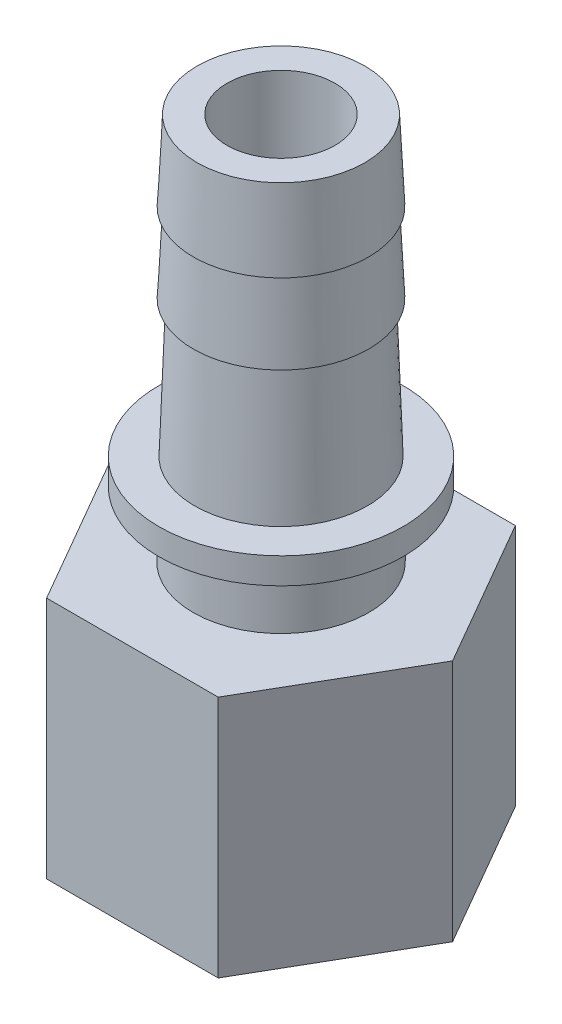
ISO-10303-21;
HEADER;
FILE_DESCRIPTION(('STEP AP214'),'2;1');
FILE_NAME('part.step','',(''),(''),'','','');
FILE_SCHEMA(('AUTOMOTIVE_DESIGN { 1 0 10303 214 1 1 1 1 }'));
ENDSEC;
DATA;
#1=APPLICATION_CONTEXT('core data for automotive mechanical design processes');
#2=APPLICATION_PROTOCOL_DEFINITION('international standard','automotive_design',2000,#1);
#3=PRODUCT_CONTEXT('',#1,'mechanical');
#4=PRODUCT('Part','Part','',(#3));
#5=PRODUCT_RELATED_PRODUCT_CATEGORY('part','',(#4));
#6=PRODUCT_DEFINITION_FORMATION('','',#4);
#7=PRODUCT_DEFINITION_CONTEXT('part definition',#1,'design');
#8=PRODUCT_DEFINITION('design','',#6,#7);
#9=PRODUCT_DEFINITION_SHAPE('','',#8);
#10=(LENGTH_UNIT() NAMED_UNIT(*) SI_UNIT(.MILLI.,.METRE.));
#11=(NAMED_UNIT(*) PLANE_ANGLE_UNIT() SI_UNIT($,.RADIAN.));
#12=(NAMED_UNIT(*) SI_UNIT($,.STERADIAN.) SOLID_ANGLE_UNIT());
#13=UNCERTAINTY_MEASURE_WITH_UNIT(LENGTH_MEASURE(1.E-05),#10,'distance_accuracy_value','');
#14=(GEOMETRIC_REPRESENTATION_CONTEXT(3) GLOBAL_UNCERTAINTY_ASSIGNED_CONTEXT((#13)) GLOBAL_UNIT_ASSIGNED_CONTEXT((#10,
#11,#12)) REPRESENTATION_CONTEXT('',''));
#15=CARTESIAN_POINT('',(0.,0.,0.));
#16=DIRECTION('',(0.,0.,1.));
#17=DIRECTION('',(1.,0.,0.));
#18=AXIS2_PLACEMENT_3D('',#15,#16,#17);
#19=CARTESIAN_POINT('',(20.156625803029,28.575,0.));
#20=DIRECTION('',(-0.866025403784439,0.,0.5));
#21=DIRECTION('',(0.5,0.,0.866025403784439));
#22=AXIS2_PLACEMENT_3D('',#19,#20,#21);
#23=PLANE('',#22);
#24=DIRECTION('',(-0.5,0.,-0.866025403784439));
#25=VECTOR('',#24,1.);
#26=CARTESIAN_POINT('',(20.156625803029,0.,0.));
#27=LINE('',#26,#25);
#28=CARTESIAN_POINT('',(20.156625803029,0.,0.));
#29=VERTEX_POINT('',#28);
#30=CARTESIAN_POINT('',(10.0783129015145,0.,-17.45615));
#31=VERTEX_POINT('',#30);
#32=EDGE_CURVE('E130',#29,#31,#27,.T.);
#33=ORIENTED_EDGE('',*,*,#32,.T.);
#34=DIRECTION('',(0.,-1.,0.));
#35=VECTOR('',#34,1.);
#36=CARTESIAN_POINT('',(10.0783129015145,28.575,-17.45615));
#37=LINE('',#36,#35);
#38=CARTESIAN_POINT('',(10.0783129015145,28.575,-17.45615));
#39=VERTEX_POINT('',#38);
#40=EDGE_CURVE('E147',#39,#31,#37,.T.);
#41=ORIENTED_EDGE('',*,*,#40,.F.);
#42=DIRECTION('',(-0.5,0.,-0.866025403784439));
#43=VECTOR('',#42,1.);
#44=CARTESIAN_POINT('',(20.156625803029,28.575,0.));
#45=LINE('',#44,#43);
#46=CARTESIAN_POINT('',(20.156625803029,28.575,0.));
#47=VERTEX_POINT('',#46);
#48=EDGE_CURVE('E141',#47,#39,#45,.T.);
#49=ORIENTED_EDGE('',*,*,#48,.F.);
#50=DIRECTION('',(0.,-1.,0.));
#51=VECTOR('',#50,1.);
#52=CARTESIAN_POINT('',(20.156625803029,28.575,0.));
#53=LINE('',#52,#51);
#54=EDGE_CURVE('E126',#47,#29,#53,.T.);
#55=ORIENTED_EDGE('',*,*,#54,.T.);
#56=EDGE_LOOP('',(#33,#41,#49,#55));
#57=FACE_BOUND('',#56,.T.);
#58=ADVANCED_FACE('F43',(#57),#23,.F.);
#59=CARTESIAN_POINT('',(10.0783129015145,28.575,-17.45615));
#60=DIRECTION('',(0.,0.,1.));
#61=DIRECTION('',(1.,0.,0.));
#62=AXIS2_PLACEMENT_3D('',#59,#60,#61);
#63=PLANE('',#62);
#64=DIRECTION('',(-1.,0.,0.));
#65=VECTOR('',#64,1.);
#66=CARTESIAN_POINT('',(10.0783129015145,0.,-17.45615));
#67=LINE('',#66,#65);
#68=CARTESIAN_POINT('',(-10.0783129015145,0.,-17.45615));
#69=VERTEX_POINT('',#68);
#70=EDGE_CURVE('E133',#31,#69,#67,.T.);
#71=ORIENTED_EDGE('',*,*,#70,.T.);
#72=DIRECTION('',(0.,-1.,0.));
#73=VECTOR('',#72,1.);
#74=CARTESIAN_POINT('',(-10.0783129015145,28.575,-17.45615));
#75=LINE('',#74,#73);
#76=CARTESIAN_POINT('',(-10.0783129015145,28.575,-17.45615));
#77=VERTEX_POINT('',#76);
#78=EDGE_CURVE('E145',#77,#69,#75,.T.);
#79=ORIENTED_EDGE('',*,*,#78,.F.);
#80=DIRECTION('',(-1.,0.,0.));
#81=VECTOR('',#80,1.);
#82=CARTESIAN_POINT('',(10.0783129015145,28.575,-17.45615));
#83=LINE('',#82,#81);
#84=EDGE_CURVE('E99',#39,#77,#83,.T.);
#85=ORIENTED_EDGE('',*,*,#84,.F.);
#86=ORIENTED_EDGE('',*,*,#40,.T.);
#87=EDGE_LOOP('',(#71,#79,#85,#86));
#88=FACE_BOUND('',#87,.T.);
#89=ADVANCED_FACE('F158',(#88),#63,.F.);
#90=CARTESIAN_POINT('',(-10.0783129015145,28.575,-17.45615));
#91=DIRECTION('',(0.866025403784439,0.,0.5));
#92=DIRECTION('',(0.5,0.,-0.866025403784438));
#93=AXIS2_PLACEMENT_3D('',#90,#91,#92);
#94=PLANE('',#93);
#95=DIRECTION('',(-0.5,0.,0.866025403784438));
#96=VECTOR('',#95,1.);
#97=CARTESIAN_POINT('',(-10.0783129015145,0.,-17.45615));
#98=LINE('',#97,#96);
#99=CARTESIAN_POINT('',(-20.156625803029,0.,0.));
#100=VERTEX_POINT('',#99);
#101=EDGE_CURVE('E136',#69,#100,#98,.T.);
#102=ORIENTED_EDGE('',*,*,#101,.T.);
#103=DIRECTION('',(0.,-1.,0.));
#104=VECTOR('',#103,1.);
#105=CARTESIAN_POINT('',(-20.156625803029,28.575,0.));
#106=LINE('',#105,#104);
#107=CARTESIAN_POINT('',(-20.156625803029,28.575,0.));
#108=VERTEX_POINT('',#107);
#109=EDGE_CURVE('E121',#108,#100,#106,.T.);
#110=ORIENTED_EDGE('',*,*,#109,.F.);
#111=DIRECTION('',(-0.5,0.,0.866025403784438));
#112=VECTOR('',#111,1.);
#113=CARTESIAN_POINT('',(-10.0783129015145,28.575,-17.45615));
#114=LINE('',#113,#112);
#115=EDGE_CURVE('E112',#77,#108,#114,.T.);
#116=ORIENTED_EDGE('',*,*,#115,.F.);
#117=ORIENTED_EDGE('',*,*,#78,.T.);
#118=EDGE_LOOP('',(#102,#110,#116,#117));
#119=FACE_BOUND('',#118,.T.);
#120=ADVANCED_FACE('F161',(#119),#94,.F.);
#121=CARTESIAN_POINT('',(-20.156625803029,28.575,0.));
#122=DIRECTION('',(0.866025403784439,0.,-0.5));
#123=DIRECTION('',(-0.5,0.,-0.866025403784439));
#124=AXIS2_PLACEMENT_3D('',#121,#122,#123);
#125=PLANE('',#124);
#126=DIRECTION('',(0.5,0.,0.866025403784439));
#127=VECTOR('',#126,1.);
#128=CARTESIAN_POINT('',(-20.156625803029,0.,0.));
#129=LINE('',#128,#127);
#130=CARTESIAN_POINT('',(-10.0783129015145,0.,17.45615));
#131=VERTEX_POINT('',#130);
#132=EDGE_CURVE('E120',#100,#131,#129,.T.);
#133=ORIENTED_EDGE('',*,*,#132,.T.);
#134=DIRECTION('',(0.,-1.,0.));
#135=VECTOR('',#134,1.);
#136=CARTESIAN_POINT('',(-10.0783129015145,28.575,17.45615));
#137=LINE('',#136,#135);
#138=CARTESIAN_POINT('',(-10.0783129015145,28.575,17.45615));
#139=VERTEX_POINT('',#138);
#140=EDGE_CURVE('E117',#139,#131,#137,.T.);
#141=ORIENTED_EDGE('',*,*,#140,.F.);
#142=DIRECTION('',(0.5,0.,0.866025403784439));
#143=VECTOR('',#142,1.);
#144=CARTESIAN_POINT('',(-20.156625803029,28.575,0.));
#145=LINE('',#144,#143);
#146=EDGE_CURVE('E106',#108,#139,#145,.T.);
#147=ORIENTED_EDGE('',*,*,#146,.F.);
#148=ORIENTED_EDGE('',*,*,#109,.T.);
#149=EDGE_LOOP('',(#133,#141,#147,#148));
#150=FACE_BOUND('',#149,.T.);
#151=ADVANCED_FACE('F118',(#150),#125,.F.);
#152=CARTESIAN_POINT('',(-10.0783129015145,28.575,17.45615));
#153=DIRECTION('',(0.,0.,-1.));
#154=DIRECTION('',(-1.,0.,0.));
#155=AXIS2_PLACEMENT_3D('',#152,#153,#154);
#156=PLANE('',#155);
#157=DIRECTION('',(1.,0.,0.));
#158=VECTOR('',#157,1.);
#159=CARTESIAN_POINT('',(-10.0783129015145,0.,17.45615));
#160=LINE('',#159,#158);
#161=CARTESIAN_POINT('',(10.0783129015145,0.,17.45615));
#162=VERTEX_POINT('',#161);
#163=EDGE_CURVE('E84',#131,#162,#160,.T.);
#164=ORIENTED_EDGE('',*,*,#163,.T.);
#165=DIRECTION('',(0.,-1.,0.));
#166=VECTOR('',#165,1.);
#167=CARTESIAN_POINT('',(10.0783129015145,28.575,17.45615));
#168=LINE('',#167,#166);
#169=CARTESIAN_POINT('',(10.0783129015145,28.575,17.45615));
#170=VERTEX_POINT('',#169);
#171=EDGE_CURVE('E122',#170,#162,#168,.T.);
#172=ORIENTED_EDGE('',*,*,#171,.F.);
#173=DIRECTION('',(1.,0.,0.));
#174=VECTOR('',#173,1.);
#175=CARTESIAN_POINT('',(-10.0783129015145,28.575,17.45615));
#176=LINE('',#175,#174);
#177=EDGE_CURVE('E110',#139,#170,#176,.T.);
#178=ORIENTED_EDGE('',*,*,#177,.F.);
#179=ORIENTED_EDGE('',*,*,#140,.T.);
#180=EDGE_LOOP('',(#164,#172,#178,#179));
#181=FACE_BOUND('',#180,.T.);
#182=ADVANCED_FACE('F124',(#181),#156,.F.);
#183=CARTESIAN_POINT('',(10.0783129015145,28.575,17.45615));
#184=DIRECTION('',(-0.866025403784439,0.,-0.5));
#185=DIRECTION('',(-0.5,0.,0.866025403784439));
#186=AXIS2_PLACEMENT_3D('',#183,#184,#185);
#187=PLANE('',#186);
#188=DIRECTION('',(0.5,0.,-0.866025403784439));
#189=VECTOR('',#188,1.);
#190=CARTESIAN_POINT('',(10.0783129015145,0.,17.45615));
#191=LINE('',#190,#189);
#192=EDGE_CURVE('E90',#162,#29,#191,.T.);
#193=ORIENTED_EDGE('',*,*,#192,.T.);
#194=ORIENTED_EDGE('',*,*,#54,.F.);
#195=DIRECTION('',(0.5,0.,-0.866025403784439));
#196=VECTOR('',#195,1.);
#197=CARTESIAN_POINT('',(10.0783129015145,28.575,17.45615));
#198=LINE('',#197,#196);
#199=EDGE_CURVE('E61',#170,#47,#198,.T.);
#200=ORIENTED_EDGE('',*,*,#199,.F.);
#201=ORIENTED_EDGE('',*,*,#171,.T.);
#202=EDGE_LOOP('',(#193,#194,#200,#201));
#203=FACE_BOUND('',#202,.T.);
#204=ADVANCED_FACE('F166',(#203),#187,.F.);
#205=CARTESIAN_POINT('',(0.,28.575,0.));
#206=DIRECTION('',(0.,1.,0.));
#207=DIRECTION('',(0.,0.,1.));
#208=AXIS2_PLACEMENT_3D('',#205,#206,#207);
#209=PLANE('',#208);
#210=CARTESIAN_POINT('',(0.,28.575,0.));
#211=DIRECTION('',(0.,1.,0.));
#212=DIRECTION('',(0.,0.,1.));
#213=AXIS2_PLACEMENT_3D('',#210,#211,#212);
#214=CIRCLE('',#213,10.3251);
#215=CARTESIAN_POINT('',(0.,28.575,10.3251));
#216=VERTEX_POINT('',#215);
#217=EDGE_CURVE('E52',#216,#216,#214,.T.);
#218=ORIENTED_EDGE('',*,*,#217,.F.);
#219=EDGE_LOOP('',(#218));
#220=FACE_BOUND('',#219,.T.);
#221=ORIENTED_EDGE('',*,*,#48,.T.);
#222=ORIENTED_EDGE('',*,*,#84,.T.);
#223=ORIENTED_EDGE('',*,*,#115,.T.);
#224=ORIENTED_EDGE('',*,*,#146,.T.);
#225=ORIENTED_EDGE('',*,*,#177,.T.);
#226=ORIENTED_EDGE('',*,*,#199,.T.);
#227=EDGE_LOOP('',(#221,#222,#223,#224,#225,#226));
#228=FACE_BOUND('',#227,.T.);
#229=ADVANCED_FACE('F108',(#220,#228),#209,.T.);
#230=CARTESIAN_POINT('',(0.,0.,0.));
#231=DIRECTION('',(0.,1.,0.));
#232=DIRECTION('',(0.,0.,1.));
#233=AXIS2_PLACEMENT_3D('',#230,#231,#232);
#234=PLANE('',#233);
#235=CARTESIAN_POINT('',(0.,0.,0.));
#236=DIRECTION('',(0.,-1.,0.));
#237=DIRECTION('',(0.,0.,-1.));
#238=AXIS2_PLACEMENT_3D('',#235,#236,#237);
#239=CIRCLE('',#238,11.7348);
#240=CARTESIAN_POINT('',(0.,0.,-11.7348));
#241=VERTEX_POINT('',#240);
#242=EDGE_CURVE('E366',#241,#241,#239,.T.);
#243=ORIENTED_EDGE('',*,*,#242,.F.);
#244=EDGE_LOOP('',(#243));
#245=FACE_BOUND('',#244,.T.);
#246=ORIENTED_EDGE('',*,*,#32,.F.);
#247=ORIENTED_EDGE('',*,*,#192,.F.);
#248=ORIENTED_EDGE('',*,*,#163,.F.);
#249=ORIENTED_EDGE('',*,*,#132,.F.);
#250=ORIENTED_EDGE('',*,*,#101,.F.);
#251=ORIENTED_EDGE('',*,*,#70,.F.);
#252=EDGE_LOOP('',(#246,#247,#248,#249,#250,#251));
#253=FACE_BOUND('',#252,.T.);
#254=ADVANCED_FACE('F164',(#245,#253),#234,.F.);
#255=CARTESIAN_POINT('',(0.,36.2712,0.));
#256=DIRECTION('',(0.,-1.,0.));
#257=DIRECTION('',(0.,0.,-1.));
#258=AXIS2_PLACEMENT_3D('',#255,#256,#257);
#259=CYLINDRICAL_SURFACE('',#258,10.3251);
#260=CARTESIAN_POINT('',(0.,36.2712,0.));
#261=DIRECTION('',(0.,1.,0.));
#262=DIRECTION('',(0.,0.,1.));
#263=AXIS2_PLACEMENT_3D('',#260,#261,#262);
#264=CIRCLE('',#263,10.3251);
#265=CARTESIAN_POINT('',(0.,36.2712,10.3251));
#266=VERTEX_POINT('',#265);
#267=EDGE_CURVE('E134',#266,#266,#264,.T.);
#268=ORIENTED_EDGE('',*,*,#267,.F.);
#269=EDGE_LOOP('',(#268));
#270=FACE_BOUND('',#269,.T.);
#271=ORIENTED_EDGE('',*,*,#217,.T.);
#272=EDGE_LOOP('',(#271));
#273=FACE_BOUND('',#272,.T.);
#274=ADVANCED_FACE('F217',(#270,#273),#259,.T.);
#275=CARTESIAN_POINT('',(0.,39.3319,0.));
#276=DIRECTION('',(0.,-1.,0.));
#277=DIRECTION('',(0.,0.,-1.));
#278=AXIS2_PLACEMENT_3D('',#275,#276,#277);
#279=CYLINDRICAL_SURFACE('',#278,14.351);
#280=CARTESIAN_POINT('',(0.,39.3319,0.));
#281=DIRECTION('',(0.,1.,0.));
#282=DIRECTION('',(0.,0.,1.));
#283=AXIS2_PLACEMENT_3D('',#280,#281,#282);
#284=CIRCLE('',#283,14.351);
#285=CARTESIAN_POINT('',(0.,39.3319,14.351));
#286=VERTEX_POINT('',#285);
#287=EDGE_CURVE('E382',#286,#286,#284,.T.);
#288=ORIENTED_EDGE('',*,*,#287,.F.);
#289=EDGE_LOOP('',(#288));
#290=FACE_BOUND('',#289,.T.);
#291=CARTESIAN_POINT('',(0.,36.2712,0.));
#292=DIRECTION('',(0.,1.,0.));
#293=DIRECTION('',(0.,0.,1.));
#294=AXIS2_PLACEMENT_3D('',#291,#292,#293);
#295=CIRCLE('',#294,14.351);
#296=CARTESIAN_POINT('',(0.,36.2712,14.351));
#297=VERTEX_POINT('',#296);
#298=EDGE_CURVE('E380',#297,#297,#295,.T.);
#299=ORIENTED_EDGE('',*,*,#298,.T.);
#300=EDGE_LOOP('',(#299));
#301=FACE_BOUND('',#300,.T.);
#302=ADVANCED_FACE('F227',(#290,#301),#279,.T.);
#303=CARTESIAN_POINT('',(0.,39.3319,0.));
#304=DIRECTION('',(0.,1.,0.));
#305=DIRECTION('',(0.,0.,1.));
#306=AXIS2_PLACEMENT_3D('',#303,#304,#305);
#307=PLANE('',#306);
#308=CARTESIAN_POINT('',(0.,39.3319,0.));
#309=DIRECTION('',(0.,1.,0.));
#310=DIRECTION('',(-1.,0.,0.));
#311=AXIS2_PLACEMENT_3D('',#308,#309,#310);
#312=CIRCLE('',#311,10.1473);
#313=CARTESIAN_POINT('',(-10.1473,39.3319,0.));
#314=VERTEX_POINT('',#313);
#315=EDGE_CURVE('E11',#314,#314,#312,.T.);
#316=ORIENTED_EDGE('',*,*,#315,.F.);
#317=EDGE_LOOP('',(#316));
#318=FACE_BOUND('',#317,.T.);
#319=ORIENTED_EDGE('',*,*,#287,.T.);
#320=EDGE_LOOP('',(#319));
#321=FACE_BOUND('',#320,.T.);
#322=ADVANCED_FACE('F237',(#318,#321),#307,.T.);
#323=CARTESIAN_POINT('',(0.,36.2712,0.));
#324=DIRECTION('',(0.,1.,0.));
#325=DIRECTION('',(0.,0.,1.));
#326=AXIS2_PLACEMENT_3D('',#323,#324,#325);
#327=PLANE('',#326);
#328=ORIENTED_EDGE('',*,*,#267,.T.);
#329=EDGE_LOOP('',(#328));
#330=FACE_BOUND('',#329,.T.);
#331=ORIENTED_EDGE('',*,*,#298,.F.);
#332=EDGE_LOOP('',(#331));
#333=FACE_BOUND('',#332,.T.);
#334=ADVANCED_FACE('F248',(#330,#333),#327,.F.);
#335=CARTESIAN_POINT('',(0.,55.3593,0.));
#336=DIRECTION('',(0.,-1.,0.));
#337=DIRECTION('',(1.,0.,0.));
#338=AXIS2_PLACEMENT_3D('',#335,#336,#337);
#339=CONICAL_SURFACE('',#338,9.6012,0.034059723549055);
#340=ORIENTED_EDGE('',*,*,#315,.T.);
#341=EDGE_LOOP('',(#340));
#342=FACE_BOUND('',#341,.T.);
#343=CARTESIAN_POINT('',(0.,55.3593,0.));
#344=DIRECTION('',(0.,1.,0.));
#345=DIRECTION('',(-1.,0.,0.));
#346=AXIS2_PLACEMENT_3D('',#343,#344,#345);
#347=CIRCLE('',#346,9.6012);
#348=CARTESIAN_POINT('',(-9.6012,55.3593,0.));
#349=VERTEX_POINT('',#348);
#350=EDGE_CURVE('E378',#349,#349,#347,.T.);
#351=ORIENTED_EDGE('',*,*,#350,.F.);
#352=EDGE_LOOP('',(#351));
#353=FACE_BOUND('',#352,.T.);
#354=ADVANCED_FACE('F258',(#342,#353),#339,.T.);
#355=CARTESIAN_POINT('',(0.,55.3593,0.));
#356=DIRECTION('',(0.,-1.,0.));
#357=DIRECTION('',(1.,0.,0.));
#358=AXIS2_PLACEMENT_3D('',#355,#356,#357);
#359=PLANE('',#358);
#360=ORIENTED_EDGE('',*,*,#350,.T.);
#361=EDGE_LOOP('',(#360));
#362=FACE_BOUND('',#361,.T.);
#363=CARTESIAN_POINT('',(0.,55.3593,0.));
#364=DIRECTION('',(0.,-1.,0.));
#365=DIRECTION('',(1.,0.,0.));
#366=AXIS2_PLACEMENT_3D('',#363,#364,#365);
#367=CIRCLE('',#366,10.29335);
#368=CARTESIAN_POINT('',(10.29335,55.3593,0.));
#369=VERTEX_POINT('',#368);
#370=EDGE_CURVE('E375',#369,#369,#367,.T.);
#371=ORIENTED_EDGE('',*,*,#370,.T.);
#372=EDGE_LOOP('',(#371));
#373=FACE_BOUND('',#372,.T.);
#374=ADVANCED_FACE('F267',(#362,#373),#359,.T.);
#375=CARTESIAN_POINT('',(0.,55.3593,0.));
#376=DIRECTION('',(0.,-1.,0.));
#377=DIRECTION('',(1.,0.,0.));
#378=AXIS2_PLACEMENT_3D('',#375,#376,#377);
#379=CONICAL_SURFACE('',#378,10.29335,0.0473899660875997);
#380=CARTESIAN_POINT('',(0.,64.7319,0.));
#381=DIRECTION('',(0.,-1.,0.));
#382=DIRECTION('',(1.,0.,0.));
#383=AXIS2_PLACEMENT_3D('',#380,#381,#382);
#384=CIRCLE('',#383,9.84885);
#385=CARTESIAN_POINT('',(9.84885,64.7319,0.));
#386=VERTEX_POINT('',#385);
#387=EDGE_CURVE('E372',#386,#386,#384,.T.);
#388=ORIENTED_EDGE('',*,*,#387,.T.);
#389=EDGE_LOOP('',(#388));
#390=FACE_BOUND('',#389,.T.);
#391=ORIENTED_EDGE('',*,*,#370,.F.);
#392=EDGE_LOOP('',(#391));
#393=FACE_BOUND('',#392,.T.);
#394=ADVANCED_FACE('F277',(#390,#393),#379,.T.);
#395=CARTESIAN_POINT('',(0.,64.7319,0.));
#396=DIRECTION('',(0.,-1.,0.));
#397=DIRECTION('',(1.,0.,0.));
#398=AXIS2_PLACEMENT_3D('',#395,#396,#397);
#399=PLANE('',#398);
#400=CARTESIAN_POINT('',(0.,64.7319,0.));
#401=DIRECTION('',(0.,-1.,0.));
#402=DIRECTION('',(1.,0.,0.));
#403=AXIS2_PLACEMENT_3D('',#400,#401,#402);
#404=CIRCLE('',#403,10.29335);
#405=CARTESIAN_POINT('',(10.29335,64.7319,0.));
#406=VERTEX_POINT('',#405);
#407=EDGE_CURVE('E369',#406,#406,#404,.T.);
#408=ORIENTED_EDGE('',*,*,#407,.T.);
#409=EDGE_LOOP('',(#408));
#410=FACE_BOUND('',#409,.T.);
#411=ORIENTED_EDGE('',*,*,#387,.F.);
#412=EDGE_LOOP('',(#411));
#413=FACE_BOUND('',#412,.T.);
#414=ADVANCED_FACE('F287',(#410,#413),#399,.T.);
#415=CARTESIAN_POINT('',(0.,74.1045,0.));
#416=DIRECTION('',(0.,-1.,0.));
#417=DIRECTION('',(1.,0.,0.));
#418=AXIS2_PLACEMENT_3D('',#415,#416,#417);
#419=CONICAL_SURFACE('',#418,9.84885,0.0473899660875999);
#420=ORIENTED_EDGE('',*,*,#407,.F.);
#421=EDGE_LOOP('',(#420));
#422=FACE_BOUND('',#421,.T.);
#423=CARTESIAN_POINT('',(0.,74.1045,0.));
#424=DIRECTION('',(0.,-1.,0.));
#425=DIRECTION('',(0.,0.,-1.));
#426=AXIS2_PLACEMENT_3D('',#423,#424,#425);
#427=CIRCLE('',#426,9.84885);
#428=CARTESIAN_POINT('',(0.,74.1044999999999,-9.84885));
#429=VERTEX_POINT('',#428);
#430=EDGE_CURVE('E356',#429,#429,#427,.T.);
#431=ORIENTED_EDGE('',*,*,#430,.T.);
#432=EDGE_LOOP('',(#431));
#433=FACE_BOUND('',#432,.T.);
#434=ADVANCED_FACE('F297',(#422,#433),#419,.T.);
#435=CARTESIAN_POINT('',(0.,19.9771,0.));
#436=DIRECTION('',(0.,-1.,0.));
#437=DIRECTION('',(0.,0.,-1.));
#438=AXIS2_PLACEMENT_3D('',#435,#436,#437);
#439=CYLINDRICAL_SURFACE('',#438,11.7348);
#440=CARTESIAN_POINT('',(0.,19.9771000000001,0.));
#441=DIRECTION('',(0.,1.,0.));
#442=DIRECTION('',(-1.,0.,0.));
#443=AXIS2_PLACEMENT_3D('',#440,#441,#442);
#444=CIRCLE('',#443,11.7348);
#445=CARTESIAN_POINT('',(-11.7348,19.9771000000001,0.));
#446=VERTEX_POINT('',#445);
#447=EDGE_CURVE('E361',#446,#446,#444,.T.);
#448=ORIENTED_EDGE('',*,*,#447,.T.);
#449=EDGE_LOOP('',(#448));
#450=FACE_BOUND('',#449,.T.);
#451=ORIENTED_EDGE('',*,*,#242,.T.);
#452=EDGE_LOOP('',(#451));
#453=FACE_BOUND('',#452,.T.);
#454=ADVANCED_FACE('F309',(#450,#453),#439,.F.);
#455=CARTESIAN_POINT('',(0.,20.5613,0.));
#456=DIRECTION('',(0.,1.,0.));
#457=DIRECTION('',(-1.,0.,0.));
#458=AXIS2_PLACEMENT_3D('',#455,#456,#457);
#459=CYLINDRICAL_SURFACE('',#458,6.3373);
#460=CARTESIAN_POINT('',(0.,74.1045,0.));
#461=DIRECTION('',(0.,-1.,0.));
#462=DIRECTION('',(0.,0.,-1.));
#463=AXIS2_PLACEMENT_3D('',#460,#461,#462);
#464=CIRCLE('',#463,6.3373);
#465=CARTESIAN_POINT('',(0.,74.1044999999999,-6.3373));
#466=VERTEX_POINT('',#465);
#467=EDGE_CURVE('E46',#466,#466,#464,.F.);
#468=ORIENTED_EDGE('',*,*,#467,.T.);
#469=EDGE_LOOP('',(#468));
#470=FACE_BOUND('',#469,.T.);
#471=CARTESIAN_POINT('',(0.,20.5613,0.));
#472=DIRECTION('',(0.,1.,0.));
#473=DIRECTION('',(-1.,0.,0.));
#474=AXIS2_PLACEMENT_3D('',#471,#472,#473);
#475=CIRCLE('',#474,6.3373);
#476=CARTESIAN_POINT('',(-6.3373,20.5613,0.));
#477=VERTEX_POINT('',#476);
#478=EDGE_CURVE('E358',#477,#477,#475,.T.);
#479=ORIENTED_EDGE('',*,*,#478,.F.);
#480=EDGE_LOOP('',(#479));
#481=FACE_BOUND('',#480,.T.);
#482=ADVANCED_FACE('F318',(#470,#481),#459,.F.);
#483=CARTESIAN_POINT('',(0.,19.9771000000001,0.));
#484=DIRECTION('',(0.,-1.,0.));
#485=DIRECTION('',(1.,0.,0.));
#486=AXIS2_PLACEMENT_3D('',#483,#484,#485);
#487=CONICAL_SURFACE('',#486,11.7348,1.46298074095866);
#488=ORIENTED_EDGE('',*,*,#478,.T.);
#489=EDGE_LOOP('',(#488));
#490=FACE_BOUND('',#489,.T.);
#491=ORIENTED_EDGE('',*,*,#447,.F.);
#492=EDGE_LOOP('',(#491));
#493=FACE_BOUND('',#492,.T.);
#494=ADVANCED_FACE('F329',(#490,#493),#487,.F.);
#495=CARTESIAN_POINT('',(-22.6762040284075,74.1045,13.0921125000001));
#496=DIRECTION('',(0.,-1.,0.));
#497=DIRECTION('',(0.,0.,-1.));
#498=AXIS2_PLACEMENT_3D('',#495,#496,#497);
#499=PLANE('',#498);
#500=ORIENTED_EDGE('',*,*,#467,.F.);
#501=EDGE_LOOP('',(#500));
#502=FACE_BOUND('',#501,.T.);
#503=ORIENTED_EDGE('',*,*,#430,.F.);
#504=EDGE_LOOP('',(#503));
#505=FACE_BOUND('',#504,.T.);
#506=ADVANCED_FACE('F339',(#502,#505),#499,.F.);
#507=CLOSED_SHELL('',(#58,#89,#120,#151,#182,#204,#229,#254,#274,#302,#322,#334,#354,#374,#394,
#414,#434,#454,#482,#494,#506));
#508=MANIFOLD_SOLID_BREP('B2',#507);
#509=ADVANCED_BREP_SHAPE_REPRESENTATION('',(#18,#508),#14);
#510=SHAPE_DEFINITION_REPRESENTATION(#9,#509);
ENDSEC;
END-ISO-10303-21;
